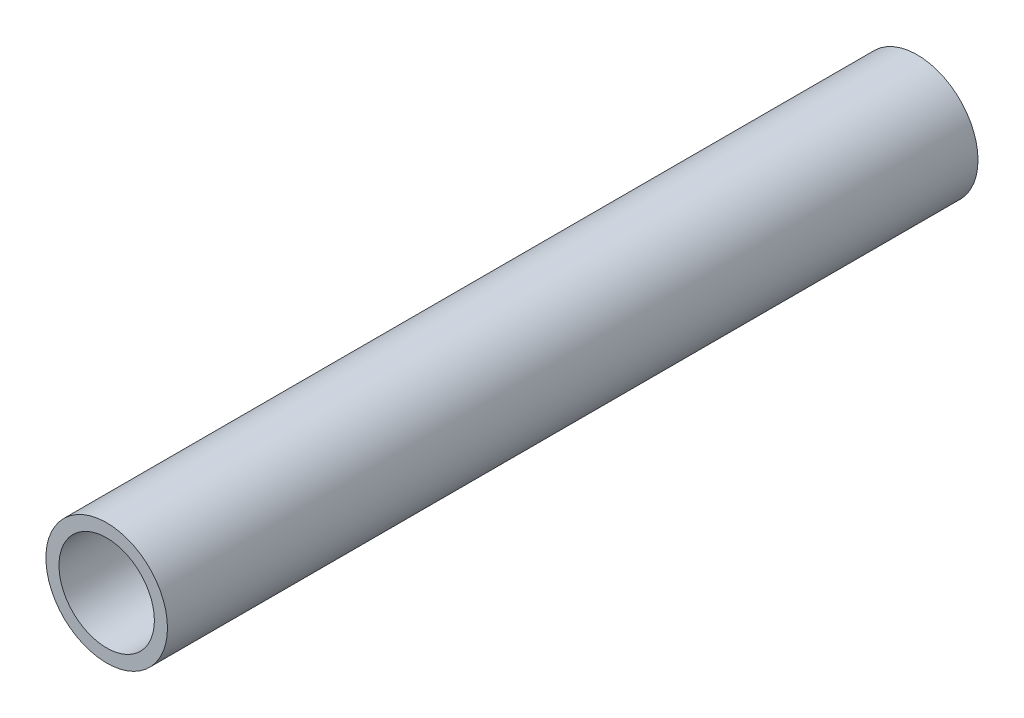
ISO-10303-21;
HEADER;
FILE_DESCRIPTION(('STEP AP214'),'2;1');
FILE_NAME('part.step','',(''),(''),'','','');
FILE_SCHEMA(('AUTOMOTIVE_DESIGN { 1 0 10303 214 1 1 1 1 }'));
ENDSEC;
DATA;
#1=APPLICATION_CONTEXT('core data for automotive mechanical design processes');
#2=APPLICATION_PROTOCOL_DEFINITION('international standard','automotive_design',2000,#1);
#3=PRODUCT_CONTEXT('',#1,'mechanical');
#4=PRODUCT('Part','Part','',(#3));
#5=PRODUCT_RELATED_PRODUCT_CATEGORY('part','',(#4));
#6=PRODUCT_DEFINITION_FORMATION('','',#4);
#7=PRODUCT_DEFINITION_CONTEXT('part definition',#1,'design');
#8=PRODUCT_DEFINITION('design','',#6,#7);
#9=PRODUCT_DEFINITION_SHAPE('','',#8);
#10=(LENGTH_UNIT() NAMED_UNIT(*) SI_UNIT(.MILLI.,.METRE.));
#11=(NAMED_UNIT(*) PLANE_ANGLE_UNIT() SI_UNIT($,.RADIAN.));
#12=(NAMED_UNIT(*) SI_UNIT($,.STERADIAN.) SOLID_ANGLE_UNIT());
#13=UNCERTAINTY_MEASURE_WITH_UNIT(LENGTH_MEASURE(1.E-05),#10,'distance_accuracy_value','');
#14=(GEOMETRIC_REPRESENTATION_CONTEXT(3) GLOBAL_UNCERTAINTY_ASSIGNED_CONTEXT((#13)) GLOBAL_UNIT_ASSIGNED_CONTEXT((#10,
#11,#12)) REPRESENTATION_CONTEXT('',''));
#15=CARTESIAN_POINT('',(0.,0.,0.));
#16=DIRECTION('',(0.,0.,1.));
#17=DIRECTION('',(1.,0.,0.));
#18=AXIS2_PLACEMENT_3D('',#15,#16,#17);
#19=CARTESIAN_POINT('',(0.,0.,177.8));
#20=DIRECTION('',(0.,0.,1.));
#21=DIRECTION('',(1.,0.,0.));
#22=AXIS2_PLACEMENT_3D('',#19,#20,#21);
#23=PLANE('',#22);
#24=CARTESIAN_POINT('',(0.,0.,177.8));
#25=DIRECTION('',(0.,0.,1.));
#26=DIRECTION('',(1.,0.,0.));
#27=AXIS2_PLACEMENT_3D('',#24,#25,#26);
#28=CIRCLE('',#27,13.335);
#29=CARTESIAN_POINT('',(13.335,0.,177.8));
#30=VERTEX_POINT('',#29);
#31=EDGE_CURVE('E10',#30,#30,#28,.T.);
#32=ORIENTED_EDGE('',*,*,#31,.T.);
#33=EDGE_LOOP('',(#32));
#34=FACE_BOUND('',#33,.T.);
#35=CARTESIAN_POINT('',(0.,0.,177.8));
#36=DIRECTION('',(0.,0.,1.));
#37=DIRECTION('',(1.,0.,0.));
#38=AXIS2_PLACEMENT_3D('',#35,#36,#37);
#39=CIRCLE('',#38,10.4648);
#40=CARTESIAN_POINT('',(10.4648,0.,177.8));
#41=VERTEX_POINT('',#40);
#42=EDGE_CURVE('E46',#41,#41,#39,.T.);
#43=ORIENTED_EDGE('',*,*,#42,.F.);
#44=EDGE_LOOP('',(#43));
#45=FACE_BOUND('',#44,.T.);
#46=ADVANCED_FACE('F35',(#34,#45),#23,.T.);
#47=CARTESIAN_POINT('',(0.,0.,0.));
#48=DIRECTION('',(0.,0.,1.));
#49=DIRECTION('',(1.,0.,0.));
#50=AXIS2_PLACEMENT_3D('',#47,#48,#49);
#51=PLANE('',#50);
#52=CARTESIAN_POINT('',(0.,0.,0.));
#53=DIRECTION('',(0.,0.,1.));
#54=DIRECTION('',(1.,0.,0.));
#55=AXIS2_PLACEMENT_3D('',#52,#53,#54);
#56=CIRCLE('',#55,13.335);
#57=CARTESIAN_POINT('',(13.335,0.,0.));
#58=VERTEX_POINT('',#57);
#59=EDGE_CURVE('E39',#58,#58,#56,.T.);
#60=ORIENTED_EDGE('',*,*,#59,.F.);
#61=EDGE_LOOP('',(#60));
#62=FACE_BOUND('',#61,.T.);
#63=CARTESIAN_POINT('',(0.,0.,0.));
#64=DIRECTION('',(0.,0.,1.));
#65=DIRECTION('',(1.,0.,0.));
#66=AXIS2_PLACEMENT_3D('',#63,#64,#65);
#67=CIRCLE('',#66,10.4648);
#68=CARTESIAN_POINT('',(10.4648,0.,0.));
#69=VERTEX_POINT('',#68);
#70=EDGE_CURVE('E48',#69,#69,#67,.T.);
#71=ORIENTED_EDGE('',*,*,#70,.T.);
#72=EDGE_LOOP('',(#71));
#73=FACE_BOUND('',#72,.T.);
#74=ADVANCED_FACE('F58',(#62,#73),#51,.F.);
#75=CARTESIAN_POINT('',(0.,0.,177.8));
#76=DIRECTION('',(0.,0.,-1.));
#77=DIRECTION('',(-1.,0.,0.));
#78=AXIS2_PLACEMENT_3D('',#75,#76,#77);
#79=CYLINDRICAL_SURFACE('',#78,13.335);
#80=ORIENTED_EDGE('',*,*,#31,.F.);
#81=EDGE_LOOP('',(#80));
#82=FACE_BOUND('',#81,.T.);
#83=ORIENTED_EDGE('',*,*,#59,.T.);
#84=EDGE_LOOP('',(#83));
#85=FACE_BOUND('',#84,.T.);
#86=ADVANCED_FACE('F37',(#82,#85),#79,.T.);
#87=CARTESIAN_POINT('',(0.,0.,177.8));
#88=DIRECTION('',(0.,0.,-1.));
#89=DIRECTION('',(-1.,0.,0.));
#90=AXIS2_PLACEMENT_3D('',#87,#88,#89);
#91=CYLINDRICAL_SURFACE('',#90,10.4648);
#92=ORIENTED_EDGE('',*,*,#42,.T.);
#93=EDGE_LOOP('',(#92));
#94=FACE_BOUND('',#93,.T.);
#95=ORIENTED_EDGE('',*,*,#70,.F.);
#96=EDGE_LOOP('',(#95));
#97=FACE_BOUND('',#96,.T.);
#98=ADVANCED_FACE('F54',(#94,#97),#91,.F.);
#99=CLOSED_SHELL('',(#46,#74,#86,#98));
#100=MANIFOLD_SOLID_BREP('B2',#99);
#101=ADVANCED_BREP_SHAPE_REPRESENTATION('',(#18,#100),#14);
#102=SHAPE_DEFINITION_REPRESENTATION(#9,#101);
ENDSEC;
END-ISO-10303-21;
